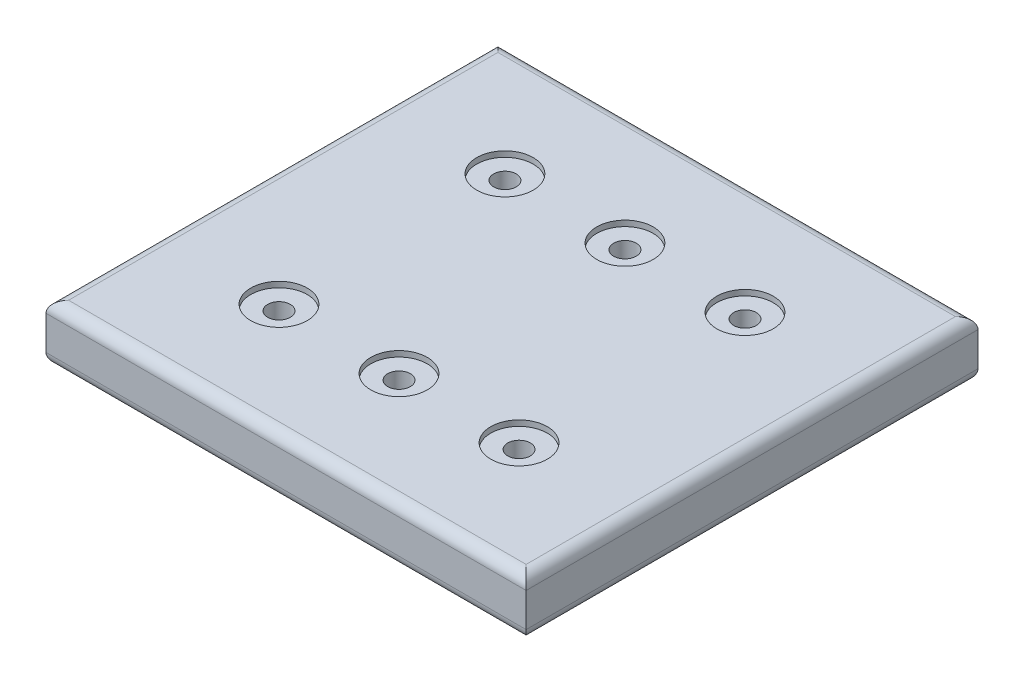
ISO-10303-21;
HEADER;
FILE_DESCRIPTION(('STEP AP214'),'2;1');
FILE_NAME('part.step','',(''),(''),'','','');
FILE_SCHEMA(('AUTOMOTIVE_DESIGN { 1 0 10303 214 1 1 1 1 }'));
ENDSEC;
DATA;
#1=APPLICATION_CONTEXT('core data for automotive mechanical design processes');
#2=APPLICATION_PROTOCOL_DEFINITION('international standard','automotive_design',2000,#1);
#3=PRODUCT_CONTEXT('',#1,'mechanical');
#4=PRODUCT('Part','Part','',(#3));
#5=PRODUCT_RELATED_PRODUCT_CATEGORY('part','',(#4));
#6=PRODUCT_DEFINITION_FORMATION('','',#4);
#7=PRODUCT_DEFINITION_CONTEXT('part definition',#1,'design');
#8=PRODUCT_DEFINITION('design','',#6,#7);
#9=PRODUCT_DEFINITION_SHAPE('','',#8);
#10=(LENGTH_UNIT() NAMED_UNIT(*) SI_UNIT(.MILLI.,.METRE.));
#11=(NAMED_UNIT(*) PLANE_ANGLE_UNIT() SI_UNIT($,.RADIAN.));
#12=(NAMED_UNIT(*) SI_UNIT($,.STERADIAN.) SOLID_ANGLE_UNIT());
#13=UNCERTAINTY_MEASURE_WITH_UNIT(LENGTH_MEASURE(1.E-05),#10,'distance_accuracy_value','');
#14=(GEOMETRIC_REPRESENTATION_CONTEXT(3) GLOBAL_UNCERTAINTY_ASSIGNED_CONTEXT((#13)) GLOBAL_UNIT_ASSIGNED_CONTEXT((#10,
#11,#12)) REPRESENTATION_CONTEXT('',''));
#15=CARTESIAN_POINT('',(0.,0.,0.));
#16=DIRECTION('',(0.,0.,1.));
#17=DIRECTION('',(1.,0.,0.));
#18=AXIS2_PLACEMENT_3D('',#15,#16,#17);
#19=CARTESIAN_POINT('',(-43.2449346461492,8.,0.));
#20=DIRECTION('',(0.,0.,-1.));
#21=DIRECTION('',(-1.,0.,0.));
#22=AXIS2_PLACEMENT_3D('',#19,#20,#21);
#23=CYLINDRICAL_SURFACE('',#22,2.);
#24=CARTESIAN_POINT('',(-43.2449346461492,8.,15.9785108341548));
#25=DIRECTION('',(-0.707106781186547,0.,-0.707106781186547));
#26=DIRECTION('',(-0.707106781186547,0.,0.707106781186547));
#27=AXIS2_PLACEMENT_3D('',#24,#25,#26);
#28=ELLIPSE('',#27,2.82842712474619,2.);
#29=CARTESIAN_POINT('',(-43.2449346461492,10.,15.9785108341548));
#30=VERTEX_POINT('',#29);
#31=CARTESIAN_POINT('',(-45.2449346461492,8.,17.9785108341548));
#32=VERTEX_POINT('',#31);
#33=EDGE_CURVE('E11',#30,#32,#28,.F.);
#34=ORIENTED_EDGE('',*,*,#33,.F.);
#35=DIRECTION('',(0.,0.,1.));
#36=VECTOR('',#35,1.);
#37=CARTESIAN_POINT('',(-43.2449346461492,10.,0.));
#38=LINE('',#37,#36);
#39=CARTESIAN_POINT('',(-43.2449346461492,10.,-60.0214891658452));
#40=VERTEX_POINT('',#39);
#41=EDGE_CURVE('E149',#40,#30,#38,.T.);
#42=ORIENTED_EDGE('',*,*,#41,.F.);
#43=CARTESIAN_POINT('',(-43.2449346461492,8.,-60.0214891658452));
#44=DIRECTION('',(0.707106781186547,0.,-0.707106781186547));
#45=DIRECTION('',(-0.707106781186547,0.,-0.707106781186547));
#46=AXIS2_PLACEMENT_3D('',#43,#44,#45);
#47=ELLIPSE('',#46,2.82842712474619,2.);
#48=CARTESIAN_POINT('',(-45.2449346461492,8.,-62.0214891658452));
#49=VERTEX_POINT('',#48);
#50=EDGE_CURVE('E40',#40,#49,#47,.F.);
#51=ORIENTED_EDGE('',*,*,#50,.T.);
#52=DIRECTION('',(0.,0.,1.));
#53=VECTOR('',#52,1.);
#54=CARTESIAN_POINT('',(-45.2449346461492,8.,0.));
#55=LINE('',#54,#53);
#56=EDGE_CURVE('E169',#32,#49,#55,.F.);
#57=ORIENTED_EDGE('',*,*,#56,.F.);
#58=EDGE_LOOP('',(#34,#42,#51,#57));
#59=FACE_BOUND('',#58,.T.);
#60=ADVANCED_FACE('F33',(#59),#23,.T.);
#61=CARTESIAN_POINT('',(0.,8.,-60.0214891658452));
#62=DIRECTION('',(1.,0.,0.));
#63=DIRECTION('',(0.,0.,-1.));
#64=AXIS2_PLACEMENT_3D('',#61,#62,#63);
#65=CYLINDRICAL_SURFACE('',#64,2.);
#66=ORIENTED_EDGE('',*,*,#50,.F.);
#67=DIRECTION('',(-1.,0.,0.));
#68=VECTOR('',#67,1.);
#69=CARTESIAN_POINT('',(0.,10.,-60.0214891658452));
#70=LINE('',#69,#68);
#71=CARTESIAN_POINT('',(37.7550653538508,10.,-60.0214891658452));
#72=VERTEX_POINT('',#71);
#73=EDGE_CURVE('E152',#72,#40,#70,.T.);
#74=ORIENTED_EDGE('',*,*,#73,.F.);
#75=CARTESIAN_POINT('',(37.7550653538508,8.,-60.0214891658452));
#76=DIRECTION('',(0.707106781186547,0.,0.707106781186547));
#77=DIRECTION('',(0.707106781186547,0.,-0.707106781186547));
#78=AXIS2_PLACEMENT_3D('',#75,#76,#77);
#79=ELLIPSE('',#78,2.82842712474619,2.);
#80=CARTESIAN_POINT('',(39.7550653538508,8.,-62.0214891658452));
#81=VERTEX_POINT('',#80);
#82=EDGE_CURVE('E54',#72,#81,#79,.F.);
#83=ORIENTED_EDGE('',*,*,#82,.T.);
#84=DIRECTION('',(-1.,0.,0.));
#85=VECTOR('',#84,1.);
#86=CARTESIAN_POINT('',(0.,8.,-62.0214891658452));
#87=LINE('',#86,#85);
#88=EDGE_CURVE('E167',#49,#81,#87,.F.);
#89=ORIENTED_EDGE('',*,*,#88,.F.);
#90=EDGE_LOOP('',(#66,#74,#83,#89));
#91=FACE_BOUND('',#90,.T.);
#92=ADVANCED_FACE('F307',(#91),#65,.T.);
#93=CARTESIAN_POINT('',(37.7550653538508,8.,0.));
#94=DIRECTION('',(0.,0.,1.));
#95=DIRECTION('',(1.,0.,0.));
#96=AXIS2_PLACEMENT_3D('',#93,#94,#95);
#97=CYLINDRICAL_SURFACE('',#96,2.);
#98=ORIENTED_EDGE('',*,*,#82,.F.);
#99=DIRECTION('',(0.,0.,-1.));
#100=VECTOR('',#99,1.);
#101=CARTESIAN_POINT('',(37.7550653538508,10.,0.));
#102=LINE('',#101,#100);
#103=CARTESIAN_POINT('',(37.7550653538508,10.,15.9785108341548));
#104=VERTEX_POINT('',#103);
#105=EDGE_CURVE('E155',#104,#72,#102,.T.);
#106=ORIENTED_EDGE('',*,*,#105,.F.);
#107=CARTESIAN_POINT('',(37.7550653538508,8.,15.9785108341548));
#108=DIRECTION('',(-0.707106781186547,0.,0.707106781186547));
#109=DIRECTION('',(0.707106781186547,0.,0.707106781186547));
#110=AXIS2_PLACEMENT_3D('',#107,#108,#109);
#111=ELLIPSE('',#110,2.82842712474619,2.);
#112=CARTESIAN_POINT('',(39.7550653538508,8.,17.9785108341548));
#113=VERTEX_POINT('',#112);
#114=EDGE_CURVE('E171',#104,#113,#111,.F.);
#115=ORIENTED_EDGE('',*,*,#114,.T.);
#116=DIRECTION('',(0.,0.,-1.));
#117=VECTOR('',#116,1.);
#118=CARTESIAN_POINT('',(39.7550653538508,8.,0.));
#119=LINE('',#118,#117);
#120=EDGE_CURVE('E164',#81,#113,#119,.F.);
#121=ORIENTED_EDGE('',*,*,#120,.F.);
#122=EDGE_LOOP('',(#98,#106,#115,#121));
#123=FACE_BOUND('',#122,.T.);
#124=ADVANCED_FACE('F176',(#123),#97,.T.);
#125=CARTESIAN_POINT('',(0.,8.,15.9785108341548));
#126=DIRECTION('',(-1.,0.,0.));
#127=DIRECTION('',(0.,0.,1.));
#128=AXIS2_PLACEMENT_3D('',#125,#126,#127);
#129=CYLINDRICAL_SURFACE('',#128,2.);
#130=DIRECTION('',(1.,0.,0.));
#131=VECTOR('',#130,1.);
#132=CARTESIAN_POINT('',(0.,10.,15.9785108341548));
#133=LINE('',#132,#131);
#134=EDGE_CURVE('E158',#30,#104,#133,.T.);
#135=ORIENTED_EDGE('',*,*,#134,.F.);
#136=ORIENTED_EDGE('',*,*,#33,.T.);
#137=DIRECTION('',(1.,0.,0.));
#138=VECTOR('',#137,1.);
#139=CARTESIAN_POINT('',(0.,8.,17.9785108341548));
#140=LINE('',#139,#138);
#141=EDGE_CURVE('E161',#113,#32,#140,.F.);
#142=ORIENTED_EDGE('',*,*,#141,.F.);
#143=ORIENTED_EDGE('',*,*,#114,.F.);
#144=EDGE_LOOP('',(#135,#136,#142,#143));
#145=FACE_BOUND('',#144,.T.);
#146=ADVANCED_FACE('F186',(#145),#129,.T.);
#147=CARTESIAN_POINT('',(0.,2.,15.9785108341548));
#148=DIRECTION('',(-1.,0.,0.));
#149=DIRECTION('',(0.,0.,1.));
#150=AXIS2_PLACEMENT_3D('',#147,#148,#149);
#151=CYLINDRICAL_SURFACE('',#150,2.);
#152=CARTESIAN_POINT('',(-43.2449346461492,2.,15.9785108341548));
#153=DIRECTION('',(-0.707106781186547,0.,-0.707106781186547));
#154=DIRECTION('',(0.707106781186547,0.,-0.707106781186547));
#155=AXIS2_PLACEMENT_3D('',#152,#153,#154);
#156=ELLIPSE('',#155,2.82842712474619,2.);
#157=CARTESIAN_POINT('',(-43.2449346461492,0.,15.9785108341548));
#158=VERTEX_POINT('',#157);
#159=CARTESIAN_POINT('',(-45.2449346461492,2.,17.9785108341548));
#160=VERTEX_POINT('',#159);
#161=EDGE_CURVE('E109',#158,#160,#156,.T.);
#162=ORIENTED_EDGE('',*,*,#161,.F.);
#163=DIRECTION('',(-1.,0.,0.));
#164=VECTOR('',#163,1.);
#165=CARTESIAN_POINT('',(0.,0.,15.9785108341548));
#166=LINE('',#165,#164);
#167=CARTESIAN_POINT('',(37.7550653538508,0.,15.9785108341548));
#168=VERTEX_POINT('',#167);
#169=EDGE_CURVE('E118',#168,#158,#166,.T.);
#170=ORIENTED_EDGE('',*,*,#169,.F.);
#171=CARTESIAN_POINT('',(37.7550653538508,2.,15.9785108341548));
#172=DIRECTION('',(-0.707106781186547,0.,0.707106781186547));
#173=DIRECTION('',(-0.707106781186547,0.,-0.707106781186547));
#174=AXIS2_PLACEMENT_3D('',#171,#172,#173);
#175=ELLIPSE('',#174,2.82842712474619,2.);
#176=CARTESIAN_POINT('',(39.7550653538508,2.,17.9785108341548));
#177=VERTEX_POINT('',#176);
#178=EDGE_CURVE('E98',#168,#177,#175,.T.);
#179=ORIENTED_EDGE('',*,*,#178,.T.);
#180=DIRECTION('',(-1.,0.,0.));
#181=VECTOR('',#180,1.);
#182=CARTESIAN_POINT('',(-45.2449346461492,2.,17.9785108341548));
#183=LINE('',#182,#181);
#184=EDGE_CURVE('E142',#160,#177,#183,.F.);
#185=ORIENTED_EDGE('',*,*,#184,.F.);
#186=EDGE_LOOP('',(#162,#170,#179,#185));
#187=FACE_BOUND('',#186,.T.);
#188=ADVANCED_FACE('F122',(#187),#151,.T.);
#189=CARTESIAN_POINT('',(37.7550653538508,2.,0.));
#190=DIRECTION('',(0.,0.,1.));
#191=DIRECTION('',(1.,0.,0.));
#192=AXIS2_PLACEMENT_3D('',#189,#190,#191);
#193=CYLINDRICAL_SURFACE('',#192,2.);
#194=ORIENTED_EDGE('',*,*,#178,.F.);
#195=DIRECTION('',(0.,0.,1.));
#196=VECTOR('',#195,1.);
#197=CARTESIAN_POINT('',(37.7550653538508,0.,0.));
#198=LINE('',#197,#196);
#199=CARTESIAN_POINT('',(37.7550653538508,0.,-60.0214891658452));
#200=VERTEX_POINT('',#199);
#201=EDGE_CURVE('E102',#200,#168,#198,.T.);
#202=ORIENTED_EDGE('',*,*,#201,.F.);
#203=CARTESIAN_POINT('',(37.7550653538508,2.,-60.0214891658452));
#204=DIRECTION('',(0.707106781186547,0.,0.707106781186547));
#205=DIRECTION('',(-0.707106781186547,0.,0.707106781186547));
#206=AXIS2_PLACEMENT_3D('',#203,#204,#205);
#207=ELLIPSE('',#206,2.82842712474619,2.);
#208=CARTESIAN_POINT('',(39.7550653538508,2.,-62.0214891658452));
#209=VERTEX_POINT('',#208);
#210=EDGE_CURVE('E110',#200,#209,#207,.T.);
#211=ORIENTED_EDGE('',*,*,#210,.T.);
#212=DIRECTION('',(0.,0.,1.));
#213=VECTOR('',#212,1.);
#214=CARTESIAN_POINT('',(39.7550653538508,2.,-62.0214891658452));
#215=LINE('',#214,#213);
#216=EDGE_CURVE('E104',#177,#209,#215,.F.);
#217=ORIENTED_EDGE('',*,*,#216,.F.);
#218=EDGE_LOOP('',(#194,#202,#211,#217));
#219=FACE_BOUND('',#218,.T.);
#220=ADVANCED_FACE('F100',(#219),#193,.T.);
#221=CARTESIAN_POINT('',(0.,2.,-60.0214891658452));
#222=DIRECTION('',(1.,0.,0.));
#223=DIRECTION('',(0.,0.,-1.));
#224=AXIS2_PLACEMENT_3D('',#221,#222,#223);
#225=CYLINDRICAL_SURFACE('',#224,2.);
#226=ORIENTED_EDGE('',*,*,#210,.F.);
#227=DIRECTION('',(1.,0.,0.));
#228=VECTOR('',#227,1.);
#229=CARTESIAN_POINT('',(0.,0.,-60.0214891658452));
#230=LINE('',#229,#228);
#231=CARTESIAN_POINT('',(-43.2449346461492,0.,-60.0214891658452));
#232=VERTEX_POINT('',#231);
#233=EDGE_CURVE('E120',#232,#200,#230,.T.);
#234=ORIENTED_EDGE('',*,*,#233,.F.);
#235=CARTESIAN_POINT('',(-43.2449346461492,2.,-60.0214891658452));
#236=DIRECTION('',(0.707106781186547,0.,-0.707106781186547));
#237=DIRECTION('',(0.707106781186547,0.,0.707106781186547));
#238=AXIS2_PLACEMENT_3D('',#235,#236,#237);
#239=ELLIPSE('',#238,2.82842712474619,2.);
#240=CARTESIAN_POINT('',(-45.2449346461492,2.,-62.0214891658452));
#241=VERTEX_POINT('',#240);
#242=EDGE_CURVE('E144',#232,#241,#239,.T.);
#243=ORIENTED_EDGE('',*,*,#242,.T.);
#244=DIRECTION('',(1.,0.,0.));
#245=VECTOR('',#244,1.);
#246=CARTESIAN_POINT('',(-45.2449346461492,2.,-62.0214891658452));
#247=LINE('',#246,#245);
#248=EDGE_CURVE('E138',#209,#241,#247,.F.);
#249=ORIENTED_EDGE('',*,*,#248,.F.);
#250=EDGE_LOOP('',(#226,#234,#243,#249));
#251=FACE_BOUND('',#250,.T.);
#252=ADVANCED_FACE('F297',(#251),#225,.T.);
#253=CARTESIAN_POINT('',(-43.2449346461492,2.,0.));
#254=DIRECTION('',(0.,0.,-1.));
#255=DIRECTION('',(-1.,0.,0.));
#256=AXIS2_PLACEMENT_3D('',#253,#254,#255);
#257=CYLINDRICAL_SURFACE('',#256,2.);
#258=DIRECTION('',(0.,0.,-1.));
#259=VECTOR('',#258,1.);
#260=CARTESIAN_POINT('',(-43.2449346461492,0.,0.));
#261=LINE('',#260,#259);
#262=EDGE_CURVE('E133',#158,#232,#261,.T.);
#263=ORIENTED_EDGE('',*,*,#262,.F.);
#264=ORIENTED_EDGE('',*,*,#161,.T.);
#265=DIRECTION('',(0.,0.,-1.));
#266=VECTOR('',#265,1.);
#267=CARTESIAN_POINT('',(-45.2449346461492,2.,-62.0214891658452));
#268=LINE('',#267,#266);
#269=EDGE_CURVE('E135',#241,#160,#268,.F.);
#270=ORIENTED_EDGE('',*,*,#269,.F.);
#271=ORIENTED_EDGE('',*,*,#242,.F.);
#272=EDGE_LOOP('',(#263,#264,#270,#271));
#273=FACE_BOUND('',#272,.T.);
#274=ADVANCED_FACE('F204',(#273),#257,.T.);
#275=CARTESIAN_POINT('',(-2.7449346461492,0.5,-22.0214891658452));
#276=DIRECTION('',(0.,1.,0.));
#277=DIRECTION('',(0.,0.,1.));
#278=AXIS2_PLACEMENT_3D('',#275,#276,#277);
#279=TOROIDAL_SURFACE('',#278,15.5,0.5);
#280=CARTESIAN_POINT('',(-2.7449346461492,0.,-22.0214891658452));
#281=DIRECTION('',(0.,1.,0.));
#282=DIRECTION('',(0.,0.,1.));
#283=AXIS2_PLACEMENT_3D('',#280,#281,#282);
#284=CIRCLE('',#283,15.5);
#285=CARTESIAN_POINT('',(-2.7449346461492,0.,-6.5214891658452));
#286=VERTEX_POINT('',#285);
#287=EDGE_CURVE('E128',#286,#286,#284,.T.);
#288=ORIENTED_EDGE('',*,*,#287,.F.);
#289=EDGE_LOOP('',(#288));
#290=FACE_BOUND('',#289,.T.);
#291=CARTESIAN_POINT('',(-2.7449346461492,0.5,-22.0214891658452));
#292=DIRECTION('',(0.,1.,0.));
#293=DIRECTION('',(0.,0.,1.));
#294=AXIS2_PLACEMENT_3D('',#291,#292,#293);
#295=CIRCLE('',#294,15.);
#296=CARTESIAN_POINT('',(-2.7449346461492,0.5,-7.0214891658452));
#297=VERTEX_POINT('',#296);
#298=EDGE_CURVE('E125',#297,#297,#295,.F.);
#299=ORIENTED_EDGE('',*,*,#298,.F.);
#300=EDGE_LOOP('',(#299));
#301=FACE_BOUND('',#300,.T.);
#302=ADVANCED_FACE('F200',(#290,#301),#279,.T.);
#303=CARTESIAN_POINT('',(-45.2449346461492,10.,-62.0214891658452));
#304=DIRECTION('',(1.,0.,0.));
#305=DIRECTION('',(0.,0.,-1.));
#306=AXIS2_PLACEMENT_3D('',#303,#304,#305);
#307=PLANE('',#306);
#308=DIRECTION('',(0.,-1.,0.));
#309=VECTOR('',#308,1.);
#310=CARTESIAN_POINT('',(-45.2449346461492,10.,17.9785108341548));
#311=LINE('',#310,#309);
#312=EDGE_CURVE('E190',#32,#160,#311,.T.);
#313=ORIENTED_EDGE('',*,*,#312,.F.);
#314=ORIENTED_EDGE('',*,*,#56,.T.);
#315=DIRECTION('',(0.,-1.,0.));
#316=VECTOR('',#315,1.);
#317=CARTESIAN_POINT('',(-45.2449346461492,10.,-62.0214891658452));
#318=LINE('',#317,#316);
#319=EDGE_CURVE('E193',#49,#241,#318,.T.);
#320=ORIENTED_EDGE('',*,*,#319,.T.);
#321=ORIENTED_EDGE('',*,*,#269,.T.);
#322=EDGE_LOOP('',(#313,#314,#320,#321));
#323=FACE_BOUND('',#322,.T.);
#324=ADVANCED_FACE('F203',(#323),#307,.F.);
#325=CARTESIAN_POINT('',(-45.2449346461492,10.,17.9785108341548));
#326=DIRECTION('',(0.,0.,-1.));
#327=DIRECTION('',(-1.,0.,0.));
#328=AXIS2_PLACEMENT_3D('',#325,#326,#327);
#329=PLANE('',#328);
#330=DIRECTION('',(0.,-1.,0.));
#331=VECTOR('',#330,1.);
#332=CARTESIAN_POINT('',(39.7550653538508,10.,17.9785108341548));
#333=LINE('',#332,#331);
#334=EDGE_CURVE('E184',#113,#177,#333,.T.);
#335=ORIENTED_EDGE('',*,*,#334,.F.);
#336=ORIENTED_EDGE('',*,*,#141,.T.);
#337=ORIENTED_EDGE('',*,*,#312,.T.);
#338=ORIENTED_EDGE('',*,*,#184,.T.);
#339=EDGE_LOOP('',(#335,#336,#337,#338));
#340=FACE_BOUND('',#339,.T.);
#341=ADVANCED_FACE('F189',(#340),#329,.F.);
#342=CARTESIAN_POINT('',(39.7550653538508,10.,-62.0214891658452));
#343=DIRECTION('',(-1.,0.,0.));
#344=DIRECTION('',(0.,0.,1.));
#345=AXIS2_PLACEMENT_3D('',#342,#343,#344);
#346=PLANE('',#345);
#347=DIRECTION('',(0.,-1.,0.));
#348=VECTOR('',#347,1.);
#349=CARTESIAN_POINT('',(39.7550653538508,10.,-62.0214891658452));
#350=LINE('',#349,#348);
#351=EDGE_CURVE('E185',#81,#209,#350,.T.);
#352=ORIENTED_EDGE('',*,*,#351,.F.);
#353=ORIENTED_EDGE('',*,*,#120,.T.);
#354=ORIENTED_EDGE('',*,*,#334,.T.);
#355=ORIENTED_EDGE('',*,*,#216,.T.);
#356=EDGE_LOOP('',(#352,#353,#354,#355));
#357=FACE_BOUND('',#356,.T.);
#358=ADVANCED_FACE('F182',(#357),#346,.F.);
#359=CARTESIAN_POINT('',(-45.2449346461492,10.,-62.0214891658452));
#360=DIRECTION('',(0.,0.,1.));
#361=DIRECTION('',(1.,0.,0.));
#362=AXIS2_PLACEMENT_3D('',#359,#360,#361);
#363=PLANE('',#362);
#364=ORIENTED_EDGE('',*,*,#319,.F.);
#365=ORIENTED_EDGE('',*,*,#88,.T.);
#366=ORIENTED_EDGE('',*,*,#351,.T.);
#367=ORIENTED_EDGE('',*,*,#248,.T.);
#368=EDGE_LOOP('',(#364,#365,#366,#367));
#369=FACE_BOUND('',#368,.T.);
#370=ADVANCED_FACE('F299',(#369),#363,.F.);
#371=CARTESIAN_POINT('',(0.,10.,0.));
#372=DIRECTION('',(0.,1.,0.));
#373=DIRECTION('',(0.,0.,1.));
#374=AXIS2_PLACEMENT_3D('',#371,#372,#373);
#375=PLANE('',#374);
#376=ORIENTED_EDGE('',*,*,#41,.T.);
#377=ORIENTED_EDGE('',*,*,#134,.T.);
#378=ORIENTED_EDGE('',*,*,#105,.T.);
#379=ORIENTED_EDGE('',*,*,#73,.T.);
#380=EDGE_LOOP('',(#376,#377,#378,#379));
#381=FACE_BOUND('',#380,.T.);
#382=CARTESIAN_POINT('',(18.5050653538508,10.,-42.0214891658452));
#383=DIRECTION('',(0.,1.,0.));
#384=DIRECTION('',(0.,0.,1.));
#385=AXIS2_PLACEMENT_3D('',#382,#383,#384);
#386=CIRCLE('',#385,5.);
#387=CARTESIAN_POINT('',(18.5050653538508,10.,-37.0214891658452));
#388=VERTEX_POINT('',#387);
#389=EDGE_CURVE('E260',#388,#388,#386,.T.);
#390=ORIENTED_EDGE('',*,*,#389,.F.);
#391=EDGE_LOOP('',(#390));
#392=FACE_BOUND('',#391,.T.);
#393=CARTESIAN_POINT('',(-23.9949346461492,10.,-2.0214891658452));
#394=DIRECTION('',(0.,1.,0.));
#395=DIRECTION('',(0.,0.,1.));
#396=AXIS2_PLACEMENT_3D('',#393,#394,#395);
#397=CIRCLE('',#396,5.);
#398=CARTESIAN_POINT('',(-23.9949346461492,10.,2.9785108341548));
#399=VERTEX_POINT('',#398);
#400=EDGE_CURVE('E267',#399,#399,#397,.T.);
#401=ORIENTED_EDGE('',*,*,#400,.F.);
#402=EDGE_LOOP('',(#401));
#403=FACE_BOUND('',#402,.T.);
#404=CARTESIAN_POINT('',(18.5050653538508,10.,-2.0214891658452));
#405=DIRECTION('',(0.,1.,0.));
#406=DIRECTION('',(0.,0.,1.));
#407=AXIS2_PLACEMENT_3D('',#404,#405,#406);
#408=CIRCLE('',#407,5.);
#409=CARTESIAN_POINT('',(18.5050653538508,10.,2.9785108341548));
#410=VERTEX_POINT('',#409);
#411=EDGE_CURVE('E266',#410,#410,#408,.T.);
#412=ORIENTED_EDGE('',*,*,#411,.F.);
#413=EDGE_LOOP('',(#412));
#414=FACE_BOUND('',#413,.T.);
#415=CARTESIAN_POINT('',(-2.7449346461492,10.,-2.0214891658452));
#416=DIRECTION('',(0.,1.,0.));
#417=DIRECTION('',(0.,0.,1.));
#418=AXIS2_PLACEMENT_3D('',#415,#416,#417);
#419=CIRCLE('',#418,5.);
#420=CARTESIAN_POINT('',(-2.7449346461492,10.,2.9785108341548));
#421=VERTEX_POINT('',#420);
#422=EDGE_CURVE('E279',#421,#421,#419,.T.);
#423=ORIENTED_EDGE('',*,*,#422,.F.);
#424=EDGE_LOOP('',(#423));
#425=FACE_BOUND('',#424,.T.);
#426=CARTESIAN_POINT('',(-23.9949346461492,10.,-42.0214891658452));
#427=DIRECTION('',(0.,1.,0.));
#428=DIRECTION('',(0.,0.,1.));
#429=AXIS2_PLACEMENT_3D('',#426,#427,#428);
#430=CIRCLE('',#429,5.);
#431=CARTESIAN_POINT('',(-23.9949346461492,10.,-37.0214891658452));
#432=VERTEX_POINT('',#431);
#433=EDGE_CURVE('E256',#432,#432,#430,.T.);
#434=ORIENTED_EDGE('',*,*,#433,.F.);
#435=EDGE_LOOP('',(#434));
#436=FACE_BOUND('',#435,.T.);
#437=CARTESIAN_POINT('',(-2.7449346461492,10.,-42.0214891658452));
#438=DIRECTION('',(0.,1.,0.));
#439=DIRECTION('',(0.,0.,1.));
#440=AXIS2_PLACEMENT_3D('',#437,#438,#439);
#441=CIRCLE('',#440,5.);
#442=CARTESIAN_POINT('',(-2.7449346461492,10.,-37.0214891658452));
#443=VERTEX_POINT('',#442);
#444=EDGE_CURVE('E278',#443,#443,#441,.T.);
#445=ORIENTED_EDGE('',*,*,#444,.F.);
#446=EDGE_LOOP('',(#445));
#447=FACE_BOUND('',#446,.T.);
#448=ADVANCED_FACE('F312',(#381,#392,#403,#414,#425,#436,#447),#375,.T.);
#449=CARTESIAN_POINT('',(0.,0.,0.));
#450=DIRECTION('',(0.,1.,0.));
#451=DIRECTION('',(0.,0.,1.));
#452=AXIS2_PLACEMENT_3D('',#449,#450,#451);
#453=PLANE('',#452);
#454=ORIENTED_EDGE('',*,*,#169,.T.);
#455=ORIENTED_EDGE('',*,*,#262,.T.);
#456=ORIENTED_EDGE('',*,*,#233,.T.);
#457=ORIENTED_EDGE('',*,*,#201,.T.);
#458=EDGE_LOOP('',(#454,#455,#456,#457));
#459=FACE_BOUND('',#458,.T.);
#460=ORIENTED_EDGE('',*,*,#287,.T.);
#461=EDGE_LOOP('',(#460));
#462=FACE_BOUND('',#461,.T.);
#463=CARTESIAN_POINT('',(-2.7449346461492,0.,-42.0214891658452));
#464=DIRECTION('',(0.,1.,0.));
#465=DIRECTION('',(0.,0.,1.));
#466=AXIS2_PLACEMENT_3D('',#463,#464,#465);
#467=CIRCLE('',#466,2.);
#468=CARTESIAN_POINT('',(-2.7449346461492,0.,-40.0214891658452));
#469=VERTEX_POINT('',#468);
#470=EDGE_CURVE('E224',#469,#469,#467,.T.);
#471=ORIENTED_EDGE('',*,*,#470,.T.);
#472=EDGE_LOOP('',(#471));
#473=FACE_BOUND('',#472,.T.);
#474=CARTESIAN_POINT('',(18.5050653538508,0.,-42.0214891658452));
#475=DIRECTION('',(0.,1.,0.));
#476=DIRECTION('',(0.,0.,1.));
#477=AXIS2_PLACEMENT_3D('',#474,#475,#476);
#478=CIRCLE('',#477,2.);
#479=CARTESIAN_POINT('',(18.5050653538508,0.,-40.0214891658452));
#480=VERTEX_POINT('',#479);
#481=EDGE_CURVE('E228',#480,#480,#478,.T.);
#482=ORIENTED_EDGE('',*,*,#481,.T.);
#483=EDGE_LOOP('',(#482));
#484=FACE_BOUND('',#483,.T.);
#485=CARTESIAN_POINT('',(-23.9949346461492,0.,-2.0214891658452));
#486=DIRECTION('',(0.,1.,0.));
#487=DIRECTION('',(0.,0.,1.));
#488=AXIS2_PLACEMENT_3D('',#485,#486,#487);
#489=CIRCLE('',#488,2.);
#490=CARTESIAN_POINT('',(-23.9949346461492,0.,-0.0214891658452004));
#491=VERTEX_POINT('',#490);
#492=EDGE_CURVE('E231',#491,#491,#489,.T.);
#493=ORIENTED_EDGE('',*,*,#492,.T.);
#494=EDGE_LOOP('',(#493));
#495=FACE_BOUND('',#494,.T.);
#496=CARTESIAN_POINT('',(-2.7449346461492,0.,-2.0214891658452));
#497=DIRECTION('',(0.,1.,0.));
#498=DIRECTION('',(0.,0.,1.));
#499=AXIS2_PLACEMENT_3D('',#496,#497,#498);
#500=CIRCLE('',#499,2.);
#501=CARTESIAN_POINT('',(-2.7449346461492,0.,-0.0214891658451974));
#502=VERTEX_POINT('',#501);
#503=EDGE_CURVE('E221',#502,#502,#500,.T.);
#504=ORIENTED_EDGE('',*,*,#503,.T.);
#505=EDGE_LOOP('',(#504));
#506=FACE_BOUND('',#505,.T.);
#507=CARTESIAN_POINT('',(18.5050653538508,0.,-2.0214891658452));
#508=DIRECTION('',(0.,1.,0.));
#509=DIRECTION('',(0.,0.,1.));
#510=AXIS2_PLACEMENT_3D('',#507,#508,#509);
#511=CIRCLE('',#510,2.);
#512=CARTESIAN_POINT('',(18.5050653538508,0.,-0.0214891658452043));
#513=VERTEX_POINT('',#512);
#514=EDGE_CURVE('E218',#513,#513,#511,.T.);
#515=ORIENTED_EDGE('',*,*,#514,.T.);
#516=EDGE_LOOP('',(#515));
#517=FACE_BOUND('',#516,.T.);
#518=CARTESIAN_POINT('',(-23.9949346461492,0.,-42.0214891658452));
#519=DIRECTION('',(0.,1.,0.));
#520=DIRECTION('',(0.,0.,1.));
#521=AXIS2_PLACEMENT_3D('',#518,#519,#520);
#522=CIRCLE('',#521,2.);
#523=CARTESIAN_POINT('',(-23.9949346461492,0.,-40.0214891658452));
#524=VERTEX_POINT('',#523);
#525=EDGE_CURVE('E227',#524,#524,#522,.T.);
#526=ORIENTED_EDGE('',*,*,#525,.T.);
#527=EDGE_LOOP('',(#526));
#528=FACE_BOUND('',#527,.T.);
#529=ADVANCED_FACE('F115',(#459,#462,#473,#484,#495,#506,#517,#528),#453,.F.);
#530=CARTESIAN_POINT('',(-2.7449346461492,9.,-42.0214891658452));
#531=DIRECTION('',(0.,1.,0.));
#532=DIRECTION('',(0.,0.,1.));
#533=AXIS2_PLACEMENT_3D('',#530,#531,#532);
#534=CYLINDRICAL_SURFACE('',#533,5.);
#535=CARTESIAN_POINT('',(-2.7449346461492,9.,-42.0214891658452));
#536=DIRECTION('',(0.,1.,0.));
#537=DIRECTION('',(0.,0.,1.));
#538=AXIS2_PLACEMENT_3D('',#535,#536,#537);
#539=CIRCLE('',#538,5.);
#540=CARTESIAN_POINT('',(-2.7449346461492,9.,-37.0214891658452));
#541=VERTEX_POINT('',#540);
#542=EDGE_CURVE('E287',#541,#541,#539,.T.);
#543=ORIENTED_EDGE('',*,*,#542,.F.);
#544=EDGE_LOOP('',(#543));
#545=FACE_BOUND('',#544,.T.);
#546=ORIENTED_EDGE('',*,*,#444,.T.);
#547=EDGE_LOOP('',(#546));
#548=FACE_BOUND('',#547,.T.);
#549=ADVANCED_FACE('F328',(#545,#548),#534,.F.);
#550=CARTESIAN_POINT('',(-2.7449346461492,9.,-42.0214891658452));
#551=DIRECTION('',(0.,1.,0.));
#552=DIRECTION('',(0.,0.,1.));
#553=AXIS2_PLACEMENT_3D('',#550,#551,#552);
#554=PLANE('',#553);
#555=CARTESIAN_POINT('',(-2.7449346461492,9.,-42.0214891658452));
#556=DIRECTION('',(0.,1.,0.));
#557=DIRECTION('',(0.,0.,1.));
#558=AXIS2_PLACEMENT_3D('',#555,#556,#557);
#559=CIRCLE('',#558,2.);
#560=CARTESIAN_POINT('',(-2.7449346461492,9.,-40.0214891658452));
#561=VERTEX_POINT('',#560);
#562=EDGE_CURVE('E253',#561,#561,#559,.T.);
#563=ORIENTED_EDGE('',*,*,#562,.F.);
#564=EDGE_LOOP('',(#563));
#565=FACE_BOUND('',#564,.T.);
#566=ORIENTED_EDGE('',*,*,#542,.T.);
#567=EDGE_LOOP('',(#566));
#568=FACE_BOUND('',#567,.T.);
#569=ADVANCED_FACE('F330',(#565,#568),#554,.T.);
#570=CARTESIAN_POINT('',(-23.9949346461492,9.,-42.0214891658452));
#571=DIRECTION('',(0.,1.,0.));
#572=DIRECTION('',(0.,0.,1.));
#573=AXIS2_PLACEMENT_3D('',#570,#571,#572);
#574=CYLINDRICAL_SURFACE('',#573,5.);
#575=CARTESIAN_POINT('',(-23.9949346461492,9.,-42.0214891658452));
#576=DIRECTION('',(0.,1.,0.));
#577=DIRECTION('',(0.,0.,1.));
#578=AXIS2_PLACEMENT_3D('',#575,#576,#577);
#579=CIRCLE('',#578,5.);
#580=CARTESIAN_POINT('',(-23.9949346461492,9.,-37.0214891658452));
#581=VERTEX_POINT('',#580);
#582=EDGE_CURVE('E257',#581,#581,#579,.T.);
#583=ORIENTED_EDGE('',*,*,#582,.F.);
#584=EDGE_LOOP('',(#583));
#585=FACE_BOUND('',#584,.T.);
#586=ORIENTED_EDGE('',*,*,#433,.T.);
#587=EDGE_LOOP('',(#586));
#588=FACE_BOUND('',#587,.T.);
#589=ADVANCED_FACE('F337',(#585,#588),#574,.F.);
#590=CARTESIAN_POINT('',(-23.9949346461492,9.,-42.0214891658452));
#591=DIRECTION('',(0.,1.,0.));
#592=DIRECTION('',(0.,0.,1.));
#593=AXIS2_PLACEMENT_3D('',#590,#591,#592);
#594=PLANE('',#593);
#595=CARTESIAN_POINT('',(-23.9949346461492,9.,-42.0214891658452));
#596=DIRECTION('',(0.,1.,0.));
#597=DIRECTION('',(0.,0.,1.));
#598=AXIS2_PLACEMENT_3D('',#595,#596,#597);
#599=CIRCLE('',#598,2.);
#600=CARTESIAN_POINT('',(-23.9949346461492,9.,-40.0214891658452));
#601=VERTEX_POINT('',#600);
#602=EDGE_CURVE('E250',#601,#601,#599,.T.);
#603=ORIENTED_EDGE('',*,*,#602,.F.);
#604=EDGE_LOOP('',(#603));
#605=FACE_BOUND('',#604,.T.);
#606=ORIENTED_EDGE('',*,*,#582,.T.);
#607=EDGE_LOOP('',(#606));
#608=FACE_BOUND('',#607,.T.);
#609=ADVANCED_FACE('F569',(#605,#608),#594,.T.);
#610=CARTESIAN_POINT('',(-2.7449346461492,9.,-2.0214891658452));
#611=DIRECTION('',(0.,1.,0.));
#612=DIRECTION('',(0.,0.,1.));
#613=AXIS2_PLACEMENT_3D('',#610,#611,#612);
#614=CYLINDRICAL_SURFACE('',#613,5.);
#615=CARTESIAN_POINT('',(-2.7449346461492,9.,-2.0214891658452));
#616=DIRECTION('',(0.,1.,0.));
#617=DIRECTION('',(0.,0.,1.));
#618=AXIS2_PLACEMENT_3D('',#615,#616,#617);
#619=CIRCLE('',#618,5.);
#620=CARTESIAN_POINT('',(-2.7449346461492,9.,2.9785108341548));
#621=VERTEX_POINT('',#620);
#622=EDGE_CURVE('E275',#621,#621,#619,.T.);
#623=ORIENTED_EDGE('',*,*,#622,.F.);
#624=EDGE_LOOP('',(#623));
#625=FACE_BOUND('',#624,.T.);
#626=ORIENTED_EDGE('',*,*,#422,.T.);
#627=EDGE_LOOP('',(#626));
#628=FACE_BOUND('',#627,.T.);
#629=ADVANCED_FACE('F560',(#625,#628),#614,.F.);
#630=CARTESIAN_POINT('',(-2.7449346461492,9.,-2.0214891658452));
#631=DIRECTION('',(0.,1.,0.));
#632=DIRECTION('',(0.,0.,1.));
#633=AXIS2_PLACEMENT_3D('',#630,#631,#632);
#634=PLANE('',#633);
#635=CARTESIAN_POINT('',(-2.7449346461492,9.,-2.0214891658452));
#636=DIRECTION('',(0.,1.,0.));
#637=DIRECTION('',(0.,0.,1.));
#638=AXIS2_PLACEMENT_3D('',#635,#636,#637);
#639=CIRCLE('',#638,2.);
#640=CARTESIAN_POINT('',(-2.7449346461492,9.,-0.0214891658451974));
#641=VERTEX_POINT('',#640);
#642=EDGE_CURVE('E247',#641,#641,#639,.T.);
#643=ORIENTED_EDGE('',*,*,#642,.F.);
#644=EDGE_LOOP('',(#643));
#645=FACE_BOUND('',#644,.T.);
#646=ORIENTED_EDGE('',*,*,#622,.T.);
#647=EDGE_LOOP('',(#646));
#648=FACE_BOUND('',#647,.T.);
#649=ADVANCED_FACE('F552',(#645,#648),#634,.T.);
#650=CARTESIAN_POINT('',(18.5050653538508,9.,-2.0214891658452));
#651=DIRECTION('',(0.,1.,0.));
#652=DIRECTION('',(0.,0.,1.));
#653=AXIS2_PLACEMENT_3D('',#650,#651,#652);
#654=CYLINDRICAL_SURFACE('',#653,5.);
#655=CARTESIAN_POINT('',(18.5050653538508,9.,-2.0214891658452));
#656=DIRECTION('',(0.,1.,0.));
#657=DIRECTION('',(0.,0.,1.));
#658=AXIS2_PLACEMENT_3D('',#655,#656,#657);
#659=CIRCLE('',#658,5.);
#660=CARTESIAN_POINT('',(18.5050653538508,9.,2.9785108341548));
#661=VERTEX_POINT('',#660);
#662=EDGE_CURVE('E282',#661,#661,#659,.T.);
#663=ORIENTED_EDGE('',*,*,#662,.F.);
#664=EDGE_LOOP('',(#663));
#665=FACE_BOUND('',#664,.T.);
#666=ORIENTED_EDGE('',*,*,#411,.T.);
#667=EDGE_LOOP('',(#666));
#668=FACE_BOUND('',#667,.T.);
#669=ADVANCED_FACE('F543',(#665,#668),#654,.F.);
#670=CARTESIAN_POINT('',(18.5050653538508,9.,-2.0214891658452));
#671=DIRECTION('',(0.,1.,0.));
#672=DIRECTION('',(0.,0.,1.));
#673=AXIS2_PLACEMENT_3D('',#670,#671,#672);
#674=PLANE('',#673);
#675=CARTESIAN_POINT('',(18.5050653538508,9.,-2.0214891658452));
#676=DIRECTION('',(0.,1.,0.));
#677=DIRECTION('',(0.,0.,1.));
#678=AXIS2_PLACEMENT_3D('',#675,#676,#677);
#679=CIRCLE('',#678,2.);
#680=CARTESIAN_POINT('',(18.5050653538508,9.,-0.0214891658452043));
#681=VERTEX_POINT('',#680);
#682=EDGE_CURVE('E244',#681,#681,#679,.T.);
#683=ORIENTED_EDGE('',*,*,#682,.F.);
#684=EDGE_LOOP('',(#683));
#685=FACE_BOUND('',#684,.T.);
#686=ORIENTED_EDGE('',*,*,#662,.T.);
#687=EDGE_LOOP('',(#686));
#688=FACE_BOUND('',#687,.T.);
#689=ADVANCED_FACE('F534',(#685,#688),#674,.T.);
#690=CARTESIAN_POINT('',(-23.9949346461492,9.,-2.0214891658452));
#691=DIRECTION('',(0.,1.,0.));
#692=DIRECTION('',(0.,0.,1.));
#693=AXIS2_PLACEMENT_3D('',#690,#691,#692);
#694=CYLINDRICAL_SURFACE('',#693,5.);
#695=CARTESIAN_POINT('',(-23.9949346461492,9.,-2.0214891658452));
#696=DIRECTION('',(0.,1.,0.));
#697=DIRECTION('',(0.,0.,1.));
#698=AXIS2_PLACEMENT_3D('',#695,#696,#697);
#699=CIRCLE('',#698,5.);
#700=CARTESIAN_POINT('',(-23.9949346461492,9.,2.9785108341548));
#701=VERTEX_POINT('',#700);
#702=EDGE_CURVE('E263',#701,#701,#699,.T.);
#703=ORIENTED_EDGE('',*,*,#702,.F.);
#704=EDGE_LOOP('',(#703));
#705=FACE_BOUND('',#704,.T.);
#706=ORIENTED_EDGE('',*,*,#400,.T.);
#707=EDGE_LOOP('',(#706));
#708=FACE_BOUND('',#707,.T.);
#709=ADVANCED_FACE('F525',(#705,#708),#694,.F.);
#710=CARTESIAN_POINT('',(-23.9949346461492,9.,-2.0214891658452));
#711=DIRECTION('',(0.,1.,0.));
#712=DIRECTION('',(0.,0.,1.));
#713=AXIS2_PLACEMENT_3D('',#710,#711,#712);
#714=PLANE('',#713);
#715=CARTESIAN_POINT('',(-23.9949346461492,9.,-2.0214891658452));
#716=DIRECTION('',(0.,1.,0.));
#717=DIRECTION('',(0.,0.,1.));
#718=AXIS2_PLACEMENT_3D('',#715,#716,#717);
#719=CIRCLE('',#718,2.);
#720=CARTESIAN_POINT('',(-23.9949346461492,9.,-0.0214891658452004));
#721=VERTEX_POINT('',#720);
#722=EDGE_CURVE('E241',#721,#721,#719,.T.);
#723=ORIENTED_EDGE('',*,*,#722,.F.);
#724=EDGE_LOOP('',(#723));
#725=FACE_BOUND('',#724,.T.);
#726=ORIENTED_EDGE('',*,*,#702,.T.);
#727=EDGE_LOOP('',(#726));
#728=FACE_BOUND('',#727,.T.);
#729=ADVANCED_FACE('F516',(#725,#728),#714,.T.);
#730=CARTESIAN_POINT('',(18.5050653538508,9.,-42.0214891658452));
#731=DIRECTION('',(0.,1.,0.));
#732=DIRECTION('',(0.,0.,1.));
#733=AXIS2_PLACEMENT_3D('',#730,#731,#732);
#734=CYLINDRICAL_SURFACE('',#733,5.);
#735=CARTESIAN_POINT('',(18.5050653538508,9.,-42.0214891658452));
#736=DIRECTION('',(0.,1.,0.));
#737=DIRECTION('',(0.,0.,1.));
#738=AXIS2_PLACEMENT_3D('',#735,#736,#737);
#739=CIRCLE('',#738,5.);
#740=CARTESIAN_POINT('',(18.5050653538508,9.,-37.0214891658452));
#741=VERTEX_POINT('',#740);
#742=EDGE_CURVE('E270',#741,#741,#739,.T.);
#743=ORIENTED_EDGE('',*,*,#742,.F.);
#744=EDGE_LOOP('',(#743));
#745=FACE_BOUND('',#744,.T.);
#746=ORIENTED_EDGE('',*,*,#389,.T.);
#747=EDGE_LOOP('',(#746));
#748=FACE_BOUND('',#747,.T.);
#749=ADVANCED_FACE('F507',(#745,#748),#734,.F.);
#750=CARTESIAN_POINT('',(18.5050653538508,9.,-42.0214891658452));
#751=DIRECTION('',(0.,1.,0.));
#752=DIRECTION('',(0.,0.,1.));
#753=AXIS2_PLACEMENT_3D('',#750,#751,#752);
#754=PLANE('',#753);
#755=CARTESIAN_POINT('',(18.5050653538508,9.,-42.0214891658452));
#756=DIRECTION('',(0.,1.,0.));
#757=DIRECTION('',(0.,0.,1.));
#758=AXIS2_PLACEMENT_3D('',#755,#756,#757);
#759=CIRCLE('',#758,2.);
#760=CARTESIAN_POINT('',(18.5050653538508,9.,-40.0214891658452));
#761=VERTEX_POINT('',#760);
#762=EDGE_CURVE('E238',#761,#761,#759,.T.);
#763=ORIENTED_EDGE('',*,*,#762,.F.);
#764=EDGE_LOOP('',(#763));
#765=FACE_BOUND('',#764,.T.);
#766=ORIENTED_EDGE('',*,*,#742,.T.);
#767=EDGE_LOOP('',(#766));
#768=FACE_BOUND('',#767,.T.);
#769=ADVANCED_FACE('F498',(#765,#768),#754,.T.);
#770=CARTESIAN_POINT('',(18.5050653538508,0.,-42.0214891658452));
#771=DIRECTION('',(0.,1.,0.));
#772=DIRECTION('',(0.,0.,1.));
#773=AXIS2_PLACEMENT_3D('',#770,#771,#772);
#774=CYLINDRICAL_SURFACE('',#773,2.);
#775=ORIENTED_EDGE('',*,*,#762,.T.);
#776=EDGE_LOOP('',(#775));
#777=FACE_BOUND('',#776,.T.);
#778=ORIENTED_EDGE('',*,*,#481,.F.);
#779=EDGE_LOOP('',(#778));
#780=FACE_BOUND('',#779,.T.);
#781=ADVANCED_FACE('F489',(#777,#780),#774,.F.);
#782=CARTESIAN_POINT('',(-23.9949346461492,0.,-2.0214891658452));
#783=DIRECTION('',(0.,1.,0.));
#784=DIRECTION('',(0.,0.,1.));
#785=AXIS2_PLACEMENT_3D('',#782,#783,#784);
#786=CYLINDRICAL_SURFACE('',#785,2.);
#787=ORIENTED_EDGE('',*,*,#722,.T.);
#788=EDGE_LOOP('',(#787));
#789=FACE_BOUND('',#788,.T.);
#790=ORIENTED_EDGE('',*,*,#492,.F.);
#791=EDGE_LOOP('',(#790));
#792=FACE_BOUND('',#791,.T.);
#793=ADVANCED_FACE('F480',(#789,#792),#786,.F.);
#794=CARTESIAN_POINT('',(18.5050653538508,0.,-2.0214891658452));
#795=DIRECTION('',(0.,1.,0.));
#796=DIRECTION('',(0.,0.,1.));
#797=AXIS2_PLACEMENT_3D('',#794,#795,#796);
#798=CYLINDRICAL_SURFACE('',#797,2.);
#799=ORIENTED_EDGE('',*,*,#682,.T.);
#800=EDGE_LOOP('',(#799));
#801=FACE_BOUND('',#800,.T.);
#802=ORIENTED_EDGE('',*,*,#514,.F.);
#803=EDGE_LOOP('',(#802));
#804=FACE_BOUND('',#803,.T.);
#805=ADVANCED_FACE('F471',(#801,#804),#798,.F.);
#806=CARTESIAN_POINT('',(-2.7449346461492,0.,-2.0214891658452));
#807=DIRECTION('',(0.,1.,0.));
#808=DIRECTION('',(0.,0.,1.));
#809=AXIS2_PLACEMENT_3D('',#806,#807,#808);
#810=CYLINDRICAL_SURFACE('',#809,2.);
#811=ORIENTED_EDGE('',*,*,#642,.T.);
#812=EDGE_LOOP('',(#811));
#813=FACE_BOUND('',#812,.T.);
#814=ORIENTED_EDGE('',*,*,#503,.F.);
#815=EDGE_LOOP('',(#814));
#816=FACE_BOUND('',#815,.T.);
#817=ADVANCED_FACE('F462',(#813,#816),#810,.F.);
#818=CARTESIAN_POINT('',(-23.9949346461492,0.,-42.0214891658452));
#819=DIRECTION('',(0.,1.,0.));
#820=DIRECTION('',(0.,0.,1.));
#821=AXIS2_PLACEMENT_3D('',#818,#819,#820);
#822=CYLINDRICAL_SURFACE('',#821,2.);
#823=ORIENTED_EDGE('',*,*,#602,.T.);
#824=EDGE_LOOP('',(#823));
#825=FACE_BOUND('',#824,.T.);
#826=ORIENTED_EDGE('',*,*,#525,.F.);
#827=EDGE_LOOP('',(#826));
#828=FACE_BOUND('',#827,.T.);
#829=ADVANCED_FACE('F453',(#825,#828),#822,.F.);
#830=CARTESIAN_POINT('',(-2.7449346461492,0.,-42.0214891658452));
#831=DIRECTION('',(0.,1.,0.));
#832=DIRECTION('',(0.,0.,1.));
#833=AXIS2_PLACEMENT_3D('',#830,#831,#832);
#834=CYLINDRICAL_SURFACE('',#833,2.);
#835=ORIENTED_EDGE('',*,*,#562,.T.);
#836=EDGE_LOOP('',(#835));
#837=FACE_BOUND('',#836,.T.);
#838=ORIENTED_EDGE('',*,*,#470,.F.);
#839=EDGE_LOOP('',(#838));
#840=FACE_BOUND('',#839,.T.);
#841=ADVANCED_FACE('F212',(#837,#840),#834,.F.);
#842=CARTESIAN_POINT('',(-2.7449346461492,5.,-22.0214891658452));
#843=DIRECTION('',(0.,-1.,0.));
#844=DIRECTION('',(0.,0.,-1.));
#845=AXIS2_PLACEMENT_3D('',#842,#843,#844);
#846=CYLINDRICAL_SURFACE('',#845,15.);
#847=ORIENTED_EDGE('',*,*,#298,.T.);
#848=EDGE_LOOP('',(#847));
#849=FACE_BOUND('',#848,.T.);
#850=CARTESIAN_POINT('',(-2.7449346461492,5.,-22.0214891658452));
#851=DIRECTION('',(0.,-1.,0.));
#852=DIRECTION('',(0.,0.,-1.));
#853=AXIS2_PLACEMENT_3D('',#850,#851,#852);
#854=CIRCLE('',#853,15.);
#855=CARTESIAN_POINT('',(-2.7449346461492,5.,-37.0214891658452));
#856=VERTEX_POINT('',#855);
#857=EDGE_CURVE('E216',#856,#856,#854,.T.);
#858=ORIENTED_EDGE('',*,*,#857,.F.);
#859=EDGE_LOOP('',(#858));
#860=FACE_BOUND('',#859,.T.);
#861=ADVANCED_FACE('F208',(#849,#860),#846,.F.);
#862=CARTESIAN_POINT('',(-2.7449346461492,5.,-22.0214891658452));
#863=DIRECTION('',(0.,-1.,0.));
#864=DIRECTION('',(0.,0.,-1.));
#865=AXIS2_PLACEMENT_3D('',#862,#863,#864);
#866=PLANE('',#865);
#867=ORIENTED_EDGE('',*,*,#857,.T.);
#868=EDGE_LOOP('',(#867));
#869=FACE_BOUND('',#868,.T.);
#870=ADVANCED_FACE('F211',(#869),#866,.T.);
#871=CLOSED_SHELL('',(#60,#92,#124,#146,#188,#220,#252,#274,#302,#324,#341,#358,#370,#448,#529,
#549,#569,#589,#609,#629,#649,#669,#689,#709,#729,#749,#769,#781,#793,#805,#817,#829,#841,#861,#870));
#872=MANIFOLD_SOLID_BREP('B2',#871);
#873=ADVANCED_BREP_SHAPE_REPRESENTATION('',(#18,#872),#14);
#874=SHAPE_DEFINITION_REPRESENTATION(#9,#873);
ENDSEC;
END-ISO-10303-21;
